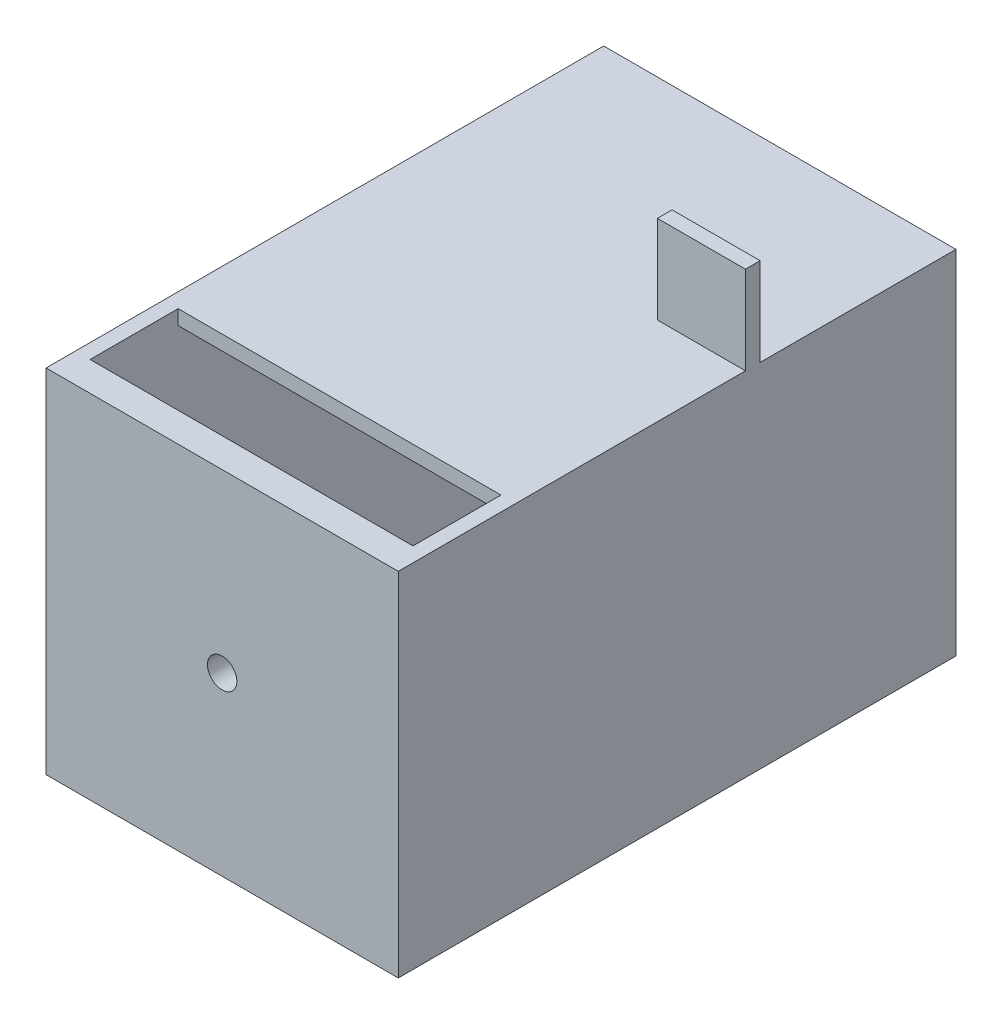
ISO-10303-21;
HEADER;
FILE_DESCRIPTION(('STEP AP214'),'2;1');
FILE_NAME('part.step','',(''),(''),'','','');
FILE_SCHEMA(('AUTOMOTIVE_DESIGN { 1 0 10303 214 1 1 1 1 }'));
ENDSEC;
DATA;
#1=APPLICATION_CONTEXT('core data for automotive mechanical design processes');
#2=APPLICATION_PROTOCOL_DEFINITION('international standard','automotive_design',2000,#1);
#3=PRODUCT_CONTEXT('',#1,'mechanical');
#4=PRODUCT('Part','Part','',(#3));
#5=PRODUCT_RELATED_PRODUCT_CATEGORY('part','',(#4));
#6=PRODUCT_DEFINITION_FORMATION('','',#4);
#7=PRODUCT_DEFINITION_CONTEXT('part definition',#1,'design');
#8=PRODUCT_DEFINITION('design','',#6,#7);
#9=PRODUCT_DEFINITION_SHAPE('','',#8);
#10=(LENGTH_UNIT() NAMED_UNIT(*) SI_UNIT(.MILLI.,.METRE.));
#11=(NAMED_UNIT(*) PLANE_ANGLE_UNIT() SI_UNIT($,.RADIAN.));
#12=(NAMED_UNIT(*) SI_UNIT($,.STERADIAN.) SOLID_ANGLE_UNIT());
#13=UNCERTAINTY_MEASURE_WITH_UNIT(LENGTH_MEASURE(1.E-05),#10,'distance_accuracy_value','');
#14=(GEOMETRIC_REPRESENTATION_CONTEXT(3) GLOBAL_UNCERTAINTY_ASSIGNED_CONTEXT((#13)) GLOBAL_UNIT_ASSIGNED_CONTEXT((#10,
#11,#12)) REPRESENTATION_CONTEXT('',''));
#15=CARTESIAN_POINT('',(0.,0.,0.));
#16=DIRECTION('',(0.,0.,1.));
#17=DIRECTION('',(1.,0.,0.));
#18=AXIS2_PLACEMENT_3D('',#15,#16,#17);
#19=CARTESIAN_POINT('',(-60.,60.,180.));
#20=DIRECTION('',(0.,-1.,0.));
#21=DIRECTION('',(0.,0.,-1.));
#22=AXIS2_PLACEMENT_3D('',#19,#20,#21);
#23=PLANE('',#22);
#24=DIRECTION('',(1.,0.,0.));
#25=VECTOR('',#24,1.);
#26=CARTESIAN_POINT('',(55.,60.,180.));
#27=LINE('',#26,#25);
#28=CARTESIAN_POINT('',(-55.,60.,180.));
#29=VERTEX_POINT('',#28);
#30=CARTESIAN_POINT('',(55.,60.,180.));
#31=VERTEX_POINT('',#30);
#32=EDGE_CURVE('E188',#29,#31,#27,.T.);
#33=ORIENTED_EDGE('',*,*,#32,.F.);
#34=DIRECTION('',(0.,0.,1.));
#35=VECTOR('',#34,1.);
#36=CARTESIAN_POINT('',(-55.,60.,180.));
#37=LINE('',#36,#35);
#38=CARTESIAN_POINT('',(-55.,60.,150.));
#39=VERTEX_POINT('',#38);
#40=EDGE_CURVE('E185',#39,#29,#37,.T.);
#41=ORIENTED_EDGE('',*,*,#40,.F.);
#42=DIRECTION('',(-1.,0.,0.));
#43=VECTOR('',#42,1.);
#44=CARTESIAN_POINT('',(55.,60.,150.));
#45=LINE('',#44,#43);
#46=CARTESIAN_POINT('',(55.,60.,150.));
#47=VERTEX_POINT('',#46);
#48=EDGE_CURVE('E199',#47,#39,#45,.T.);
#49=ORIENTED_EDGE('',*,*,#48,.F.);
#50=DIRECTION('',(0.,0.,-1.));
#51=VECTOR('',#50,1.);
#52=CARTESIAN_POINT('',(55.,60.,180.));
#53=LINE('',#52,#51);
#54=EDGE_CURVE('E196',#31,#47,#53,.T.);
#55=ORIENTED_EDGE('',*,*,#54,.F.);
#56=EDGE_LOOP('',(#33,#41,#49,#55));
#57=FACE_BOUND('',#56,.T.);
#58=DIRECTION('',(1.,0.,0.));
#59=VECTOR('',#58,1.);
#60=CARTESIAN_POINT('',(60.,60.,71.7017708237825));
#61=LINE('',#60,#59);
#62=CARTESIAN_POINT('',(30.,60.,71.7017708237825));
#63=VERTEX_POINT('',#62);
#64=CARTESIAN_POINT('',(60.,60.,71.7017708237825));
#65=VERTEX_POINT('',#64);
#66=EDGE_CURVE('E54',#63,#65,#61,.T.);
#67=ORIENTED_EDGE('',*,*,#66,.F.);
#68=DIRECTION('',(0.,0.,1.));
#69=VECTOR('',#68,1.);
#70=CARTESIAN_POINT('',(30.,60.,66.7017708237825));
#71=LINE('',#70,#69);
#72=CARTESIAN_POINT('',(30.,60.,66.7017708237825));
#73=VERTEX_POINT('',#72);
#74=EDGE_CURVE('E324',#73,#63,#71,.T.);
#75=ORIENTED_EDGE('',*,*,#74,.F.);
#76=DIRECTION('',(-1.,0.,0.));
#77=VECTOR('',#76,1.);
#78=CARTESIAN_POINT('',(60.,60.,66.7017708237825));
#79=LINE('',#78,#77);
#80=CARTESIAN_POINT('',(60.,60.,66.7017708237825));
#81=VERTEX_POINT('',#80);
#82=EDGE_CURVE('E60',#81,#73,#79,.T.);
#83=ORIENTED_EDGE('',*,*,#82,.F.);
#84=DIRECTION('',(0.,0.,-1.));
#85=VECTOR('',#84,1.);
#86=CARTESIAN_POINT('',(60.,60.,180.));
#87=LINE('',#86,#85);
#88=CARTESIAN_POINT('',(60.,60.,0.));
#89=VERTEX_POINT('',#88);
#90=EDGE_CURVE('E184',#81,#89,#87,.T.);
#91=ORIENTED_EDGE('',*,*,#90,.T.);
#92=DIRECTION('',(-1.,0.,0.));
#93=VECTOR('',#92,1.);
#94=CARTESIAN_POINT('',(-60.,60.,0.));
#95=LINE('',#94,#93);
#96=CARTESIAN_POINT('',(-60.,60.,0.));
#97=VERTEX_POINT('',#96);
#98=EDGE_CURVE('E253',#89,#97,#95,.T.);
#99=ORIENTED_EDGE('',*,*,#98,.T.);
#100=DIRECTION('',(0.,0.,-1.));
#101=VECTOR('',#100,1.);
#102=CARTESIAN_POINT('',(-60.,60.,180.));
#103=LINE('',#102,#101);
#104=CARTESIAN_POINT('',(-60.,60.,190.));
#105=VERTEX_POINT('',#104);
#106=EDGE_CURVE('E298',#105,#97,#103,.T.);
#107=ORIENTED_EDGE('',*,*,#106,.F.);
#108=DIRECTION('',(-1.,0.,0.));
#109=VECTOR('',#108,1.);
#110=CARTESIAN_POINT('',(-60.,60.,190.));
#111=LINE('',#110,#109);
#112=CARTESIAN_POINT('',(60.,60.,190.));
#113=VERTEX_POINT('',#112);
#114=EDGE_CURVE('E219',#113,#105,#111,.T.);
#115=ORIENTED_EDGE('',*,*,#114,.F.);
#116=EDGE_CURVE('E47',#113,#65,#87,.T.);
#117=ORIENTED_EDGE('',*,*,#116,.T.);
#118=EDGE_LOOP('',(#67,#75,#83,#91,#99,#107,#115,#117));
#119=FACE_BOUND('',#118,.T.);
#120=ADVANCED_FACE('F39',(#57,#119),#23,.F.);
#121=CARTESIAN_POINT('',(60.,60.,180.));
#122=DIRECTION('',(-1.,0.,0.));
#123=DIRECTION('',(0.,-1.,0.));
#124=AXIS2_PLACEMENT_3D('',#121,#122,#123);
#125=PLANE('',#124);
#126=DIRECTION('',(0.,1.,0.));
#127=VECTOR('',#126,1.);
#128=CARTESIAN_POINT('',(60.,60.,0.));
#129=LINE('',#128,#127);
#130=CARTESIAN_POINT('',(60.,-60.,0.));
#131=VERTEX_POINT('',#130);
#132=EDGE_CURVE('E251',#131,#89,#129,.T.);
#133=ORIENTED_EDGE('',*,*,#132,.T.);
#134=ORIENTED_EDGE('',*,*,#90,.F.);
#135=DIRECTION('',(0.,-1.,0.));
#136=VECTOR('',#135,1.);
#137=CARTESIAN_POINT('',(60.,90.,66.7017708237825));
#138=LINE('',#137,#136);
#139=CARTESIAN_POINT('',(60.,90.,66.7017708237825));
#140=VERTEX_POINT('',#139);
#141=EDGE_CURVE('E167',#140,#81,#138,.T.);
#142=ORIENTED_EDGE('',*,*,#141,.F.);
#143=DIRECTION('',(0.,0.,-1.));
#144=VECTOR('',#143,1.);
#145=CARTESIAN_POINT('',(60.,90.,66.7017708237825));
#146=LINE('',#145,#144);
#147=CARTESIAN_POINT('',(60.,90.,71.7017708237825));
#148=VERTEX_POINT('',#147);
#149=EDGE_CURVE('E173',#148,#140,#146,.T.);
#150=ORIENTED_EDGE('',*,*,#149,.F.);
#151=DIRECTION('',(0.,-1.,0.));
#152=VECTOR('',#151,1.);
#153=CARTESIAN_POINT('',(60.,90.,71.7017708237825));
#154=LINE('',#153,#152);
#155=EDGE_CURVE('E317',#148,#65,#154,.T.);
#156=ORIENTED_EDGE('',*,*,#155,.T.);
#157=ORIENTED_EDGE('',*,*,#116,.F.);
#158=DIRECTION('',(0.,1.,0.));
#159=VECTOR('',#158,1.);
#160=CARTESIAN_POINT('',(60.,60.,190.));
#161=LINE('',#160,#159);
#162=CARTESIAN_POINT('',(60.,-60.,190.));
#163=VERTEX_POINT('',#162);
#164=EDGE_CURVE('E216',#163,#113,#161,.T.);
#165=ORIENTED_EDGE('',*,*,#164,.F.);
#166=DIRECTION('',(0.,0.,-1.));
#167=VECTOR('',#166,1.);
#168=CARTESIAN_POINT('',(60.,-60.,180.));
#169=LINE('',#168,#167);
#170=EDGE_CURVE('E11',#163,#131,#169,.T.);
#171=ORIENTED_EDGE('',*,*,#170,.T.);
#172=EDGE_LOOP('',(#133,#134,#142,#150,#156,#157,#165,#171));
#173=FACE_BOUND('',#172,.T.);
#174=ADVANCED_FACE('F41',(#173),#125,.F.);
#175=CARTESIAN_POINT('',(-60.,60.,180.));
#176=DIRECTION('',(1.,0.,0.));
#177=DIRECTION('',(0.,1.,0.));
#178=AXIS2_PLACEMENT_3D('',#175,#176,#177);
#179=PLANE('',#178);
#180=DIRECTION('',(0.,-1.,0.));
#181=VECTOR('',#180,1.);
#182=CARTESIAN_POINT('',(-60.,60.,0.));
#183=LINE('',#182,#181);
#184=CARTESIAN_POINT('',(-60.,-60.,0.));
#185=VERTEX_POINT('',#184);
#186=EDGE_CURVE('E255',#97,#185,#183,.T.);
#187=ORIENTED_EDGE('',*,*,#186,.T.);
#188=DIRECTION('',(0.,0.,-1.));
#189=VECTOR('',#188,1.);
#190=CARTESIAN_POINT('',(-60.,-60.,180.));
#191=LINE('',#190,#189);
#192=CARTESIAN_POINT('',(-60.,-60.,190.));
#193=VERTEX_POINT('',#192);
#194=EDGE_CURVE('E295',#193,#185,#191,.T.);
#195=ORIENTED_EDGE('',*,*,#194,.F.);
#196=DIRECTION('',(0.,-1.,0.));
#197=VECTOR('',#196,1.);
#198=CARTESIAN_POINT('',(-60.,60.,190.));
#199=LINE('',#198,#197);
#200=EDGE_CURVE('E222',#105,#193,#199,.T.);
#201=ORIENTED_EDGE('',*,*,#200,.F.);
#202=ORIENTED_EDGE('',*,*,#106,.T.);
#203=EDGE_LOOP('',(#187,#195,#201,#202));
#204=FACE_BOUND('',#203,.T.);
#205=ADVANCED_FACE('F310',(#204),#179,.F.);
#206=CARTESIAN_POINT('',(-60.,-60.,180.));
#207=DIRECTION('',(0.,1.,0.));
#208=DIRECTION('',(-1.,0.,0.));
#209=AXIS2_PLACEMENT_3D('',#206,#207,#208);
#210=PLANE('',#209);
#211=DIRECTION('',(1.,0.,0.));
#212=VECTOR('',#211,1.);
#213=CARTESIAN_POINT('',(-60.,-60.,0.));
#214=LINE('',#213,#212);
#215=CARTESIAN_POINT('',(-40.,-60.,0.));
#216=VERTEX_POINT('',#215);
#217=EDGE_CURVE('E257',#185,#216,#214,.T.);
#218=ORIENTED_EDGE('',*,*,#217,.T.);
#219=DIRECTION('',(0.,0.,-1.));
#220=VECTOR('',#219,1.);
#221=CARTESIAN_POINT('',(-40.,-60.,180.));
#222=LINE('',#221,#220);
#223=CARTESIAN_POINT('',(-40.,-60.,180.));
#224=VERTEX_POINT('',#223);
#225=EDGE_CURVE('E292',#224,#216,#222,.T.);
#226=ORIENTED_EDGE('',*,*,#225,.F.);
#227=DIRECTION('',(1.,0.,0.));
#228=VECTOR('',#227,1.);
#229=CARTESIAN_POINT('',(-60.,-60.,180.));
#230=LINE('',#229,#228);
#231=CARTESIAN_POINT('',(40.,-60.,180.));
#232=VERTEX_POINT('',#231);
#233=EDGE_CURVE('E213',#224,#232,#230,.T.);
#234=ORIENTED_EDGE('',*,*,#233,.T.);
#235=DIRECTION('',(0.,0.,-1.));
#236=VECTOR('',#235,1.);
#237=CARTESIAN_POINT('',(40.,-60.,180.));
#238=LINE('',#237,#236);
#239=CARTESIAN_POINT('',(40.,-60.,0.));
#240=VERTEX_POINT('',#239);
#241=EDGE_CURVE('E248',#232,#240,#238,.T.);
#242=ORIENTED_EDGE('',*,*,#241,.T.);
#243=DIRECTION('',(1.,0.,0.));
#244=VECTOR('',#243,1.);
#245=CARTESIAN_POINT('',(40.,-60.,0.));
#246=LINE('',#245,#244);
#247=EDGE_CURVE('E228',#240,#131,#246,.T.);
#248=ORIENTED_EDGE('',*,*,#247,.T.);
#249=ORIENTED_EDGE('',*,*,#170,.F.);
#250=DIRECTION('',(1.,0.,0.));
#251=VECTOR('',#250,1.);
#252=CARTESIAN_POINT('',(-60.,-60.,190.));
#253=LINE('',#252,#251);
#254=EDGE_CURVE('E225',#193,#163,#253,.T.);
#255=ORIENTED_EDGE('',*,*,#254,.F.);
#256=ORIENTED_EDGE('',*,*,#194,.T.);
#257=EDGE_LOOP('',(#218,#226,#234,#242,#248,#249,#255,#256));
#258=FACE_BOUND('',#257,.T.);
#259=ADVANCED_FACE('F314',(#258),#210,.F.);
#260=CARTESIAN_POINT('',(-40.,-60.,180.));
#261=DIRECTION('',(-1.,0.,0.));
#262=DIRECTION('',(0.,0.,1.));
#263=AXIS2_PLACEMENT_3D('',#260,#261,#262);
#264=PLANE('',#263);
#265=DIRECTION('',(0.,1.,0.));
#266=VECTOR('',#265,1.);
#267=CARTESIAN_POINT('',(-40.,-60.,0.));
#268=LINE('',#267,#266);
#269=CARTESIAN_POINT('',(-40.,-55.,0.));
#270=VERTEX_POINT('',#269);
#271=EDGE_CURVE('E259',#216,#270,#268,.T.);
#272=ORIENTED_EDGE('',*,*,#271,.T.);
#273=DIRECTION('',(0.,0.,-1.));
#274=VECTOR('',#273,1.);
#275=CARTESIAN_POINT('',(-40.,-55.,180.));
#276=LINE('',#275,#274);
#277=CARTESIAN_POINT('',(-40.,-55.,180.));
#278=VERTEX_POINT('',#277);
#279=EDGE_CURVE('E289',#278,#270,#276,.T.);
#280=ORIENTED_EDGE('',*,*,#279,.F.);
#281=DIRECTION('',(0.,1.,0.));
#282=VECTOR('',#281,1.);
#283=CARTESIAN_POINT('',(-40.,-60.,180.));
#284=LINE('',#283,#282);
#285=EDGE_CURVE('E231',#224,#278,#284,.T.);
#286=ORIENTED_EDGE('',*,*,#285,.F.);
#287=ORIENTED_EDGE('',*,*,#225,.T.);
#288=EDGE_LOOP('',(#272,#280,#286,#287));
#289=FACE_BOUND('',#288,.T.);
#290=ADVANCED_FACE('F351',(#289),#264,.F.);
#291=CARTESIAN_POINT('',(-40.,-55.,180.));
#292=DIRECTION('',(0.,-1.,0.));
#293=DIRECTION('',(1.,0.,0.));
#294=AXIS2_PLACEMENT_3D('',#291,#292,#293);
#295=PLANE('',#294);
#296=DIRECTION('',(-1.,0.,0.));
#297=VECTOR('',#296,1.);
#298=CARTESIAN_POINT('',(-40.,-55.,0.));
#299=LINE('',#298,#297);
#300=CARTESIAN_POINT('',(-55.,-55.,0.));
#301=VERTEX_POINT('',#300);
#302=EDGE_CURVE('E261',#270,#301,#299,.T.);
#303=ORIENTED_EDGE('',*,*,#302,.T.);
#304=DIRECTION('',(0.,0.,-1.));
#305=VECTOR('',#304,1.);
#306=CARTESIAN_POINT('',(-55.,-55.,180.));
#307=LINE('',#306,#305);
#308=CARTESIAN_POINT('',(-55.,-55.,180.));
#309=VERTEX_POINT('',#308);
#310=EDGE_CURVE('E286',#309,#301,#307,.T.);
#311=ORIENTED_EDGE('',*,*,#310,.F.);
#312=DIRECTION('',(-1.,0.,0.));
#313=VECTOR('',#312,1.);
#314=CARTESIAN_POINT('',(-40.,-55.,180.));
#315=LINE('',#314,#313);
#316=EDGE_CURVE('E234',#278,#309,#315,.T.);
#317=ORIENTED_EDGE('',*,*,#316,.F.);
#318=ORIENTED_EDGE('',*,*,#279,.T.);
#319=EDGE_LOOP('',(#303,#311,#317,#318));
#320=FACE_BOUND('',#319,.T.);
#321=ADVANCED_FACE('F354',(#320),#295,.F.);
#322=CARTESIAN_POINT('',(-55.,-55.,180.));
#323=DIRECTION('',(-1.,0.,0.));
#324=DIRECTION('',(0.,0.,1.));
#325=AXIS2_PLACEMENT_3D('',#322,#323,#324);
#326=PLANE('',#325);
#327=DIRECTION('',(0.,0.,-1.));
#328=VECTOR('',#327,1.);
#329=CARTESIAN_POINT('',(-55.,55.,180.));
#330=LINE('',#329,#328);
#331=CARTESIAN_POINT('',(-55.,55.,150.));
#332=VERTEX_POINT('',#331);
#333=CARTESIAN_POINT('',(-55.,55.,0.));
#334=VERTEX_POINT('',#333);
#335=EDGE_CURVE('E284',#332,#334,#330,.T.);
#336=ORIENTED_EDGE('',*,*,#335,.F.);
#337=DIRECTION('',(0.,1.,0.));
#338=VECTOR('',#337,1.);
#339=CARTESIAN_POINT('',(-55.,50.,150.));
#340=LINE('',#339,#338);
#341=EDGE_CURVE('E203',#332,#39,#340,.T.);
#342=ORIENTED_EDGE('',*,*,#341,.T.);
#343=ORIENTED_EDGE('',*,*,#40,.T.);
#344=DIRECTION('',(0.,1.,0.));
#345=VECTOR('',#344,1.);
#346=CARTESIAN_POINT('',(-55.,-55.,180.));
#347=LINE('',#346,#345);
#348=EDGE_CURVE('E238',#309,#29,#347,.T.);
#349=ORIENTED_EDGE('',*,*,#348,.F.);
#350=ORIENTED_EDGE('',*,*,#310,.T.);
#351=DIRECTION('',(0.,1.,0.));
#352=VECTOR('',#351,1.);
#353=CARTESIAN_POINT('',(-55.,-55.,0.));
#354=LINE('',#353,#352);
#355=EDGE_CURVE('E263',#301,#334,#354,.T.);
#356=ORIENTED_EDGE('',*,*,#355,.T.);
#357=EDGE_LOOP('',(#336,#342,#343,#349,#350,#356));
#358=FACE_BOUND('',#357,.T.);
#359=ADVANCED_FACE('F358',(#358),#326,.F.);
#360=CARTESIAN_POINT('',(55.,55.,180.));
#361=DIRECTION('',(0.,1.,0.));
#362=DIRECTION('',(0.,0.,1.));
#363=AXIS2_PLACEMENT_3D('',#360,#361,#362);
#364=PLANE('',#363);
#365=DIRECTION('',(0.,0.,-1.));
#366=VECTOR('',#365,1.);
#367=CARTESIAN_POINT('',(55.,55.,180.));
#368=LINE('',#367,#366);
#369=CARTESIAN_POINT('',(55.,55.,150.));
#370=VERTEX_POINT('',#369);
#371=CARTESIAN_POINT('',(55.,55.,0.));
#372=VERTEX_POINT('',#371);
#373=EDGE_CURVE('E282',#370,#372,#368,.T.);
#374=ORIENTED_EDGE('',*,*,#373,.F.);
#375=DIRECTION('',(-1.,0.,0.));
#376=VECTOR('',#375,1.);
#377=CARTESIAN_POINT('',(55.,55.,150.));
#378=LINE('',#377,#376);
#379=EDGE_CURVE('E205',#370,#332,#378,.T.);
#380=ORIENTED_EDGE('',*,*,#379,.T.);
#381=ORIENTED_EDGE('',*,*,#335,.T.);
#382=DIRECTION('',(1.,0.,0.));
#383=VECTOR('',#382,1.);
#384=CARTESIAN_POINT('',(55.,55.,0.));
#385=LINE('',#384,#383);
#386=EDGE_CURVE('E266',#334,#372,#385,.T.);
#387=ORIENTED_EDGE('',*,*,#386,.T.);
#388=EDGE_LOOP('',(#374,#380,#381,#387));
#389=FACE_BOUND('',#388,.T.);
#390=ADVANCED_FACE('F362',(#389),#364,.F.);
#391=CARTESIAN_POINT('',(55.,-55.,180.));
#392=DIRECTION('',(1.,0.,0.));
#393=DIRECTION('',(0.,0.,-1.));
#394=AXIS2_PLACEMENT_3D('',#391,#392,#393);
#395=PLANE('',#394);
#396=DIRECTION('',(0.,-1.,0.));
#397=VECTOR('',#396,1.);
#398=CARTESIAN_POINT('',(55.,-55.,180.));
#399=LINE('',#398,#397);
#400=CARTESIAN_POINT('',(55.,-55.,180.));
#401=VERTEX_POINT('',#400);
#402=EDGE_CURVE('E240',#31,#401,#399,.T.);
#403=ORIENTED_EDGE('',*,*,#402,.F.);
#404=ORIENTED_EDGE('',*,*,#54,.T.);
#405=DIRECTION('',(0.,1.,0.));
#406=VECTOR('',#405,1.);
#407=CARTESIAN_POINT('',(55.,50.,150.));
#408=LINE('',#407,#406);
#409=EDGE_CURVE('E202',#370,#47,#408,.T.);
#410=ORIENTED_EDGE('',*,*,#409,.F.);
#411=ORIENTED_EDGE('',*,*,#373,.T.);
#412=DIRECTION('',(0.,-1.,0.));
#413=VECTOR('',#412,1.);
#414=CARTESIAN_POINT('',(55.,-55.,0.));
#415=LINE('',#414,#413);
#416=CARTESIAN_POINT('',(55.,-55.,0.));
#417=VERTEX_POINT('',#416);
#418=EDGE_CURVE('E269',#372,#417,#415,.T.);
#419=ORIENTED_EDGE('',*,*,#418,.T.);
#420=DIRECTION('',(0.,0.,-1.));
#421=VECTOR('',#420,1.);
#422=CARTESIAN_POINT('',(55.,-55.,180.));
#423=LINE('',#422,#421);
#424=EDGE_CURVE('E279',#401,#417,#423,.T.);
#425=ORIENTED_EDGE('',*,*,#424,.F.);
#426=EDGE_LOOP('',(#403,#404,#410,#411,#419,#425));
#427=FACE_BOUND('',#426,.T.);
#428=ADVANCED_FACE('F366',(#427),#395,.F.);
#429=CARTESIAN_POINT('',(55.,-55.,180.));
#430=DIRECTION('',(0.,-1.,0.));
#431=DIRECTION('',(1.,0.,0.));
#432=AXIS2_PLACEMENT_3D('',#429,#430,#431);
#433=PLANE('',#432);
#434=DIRECTION('',(-1.,0.,0.));
#435=VECTOR('',#434,1.);
#436=CARTESIAN_POINT('',(55.,-55.,0.));
#437=LINE('',#436,#435);
#438=CARTESIAN_POINT('',(40.,-55.,0.));
#439=VERTEX_POINT('',#438);
#440=EDGE_CURVE('E271',#417,#439,#437,.T.);
#441=ORIENTED_EDGE('',*,*,#440,.T.);
#442=DIRECTION('',(0.,0.,-1.));
#443=VECTOR('',#442,1.);
#444=CARTESIAN_POINT('',(40.,-55.,180.));
#445=LINE('',#444,#443);
#446=CARTESIAN_POINT('',(40.,-55.,180.));
#447=VERTEX_POINT('',#446);
#448=EDGE_CURVE('E276',#447,#439,#445,.T.);
#449=ORIENTED_EDGE('',*,*,#448,.F.);
#450=DIRECTION('',(-1.,0.,0.));
#451=VECTOR('',#450,1.);
#452=CARTESIAN_POINT('',(55.,-55.,180.));
#453=LINE('',#452,#451);
#454=EDGE_CURVE('E242',#401,#447,#453,.T.);
#455=ORIENTED_EDGE('',*,*,#454,.F.);
#456=ORIENTED_EDGE('',*,*,#424,.T.);
#457=EDGE_LOOP('',(#441,#449,#455,#456));
#458=FACE_BOUND('',#457,.T.);
#459=ADVANCED_FACE('F370',(#458),#433,.F.);
#460=CARTESIAN_POINT('',(40.,-60.,180.));
#461=DIRECTION('',(1.,0.,0.));
#462=DIRECTION('',(0.,0.,-1.));
#463=AXIS2_PLACEMENT_3D('',#460,#461,#462);
#464=PLANE('',#463);
#465=DIRECTION('',(0.,-1.,0.));
#466=VECTOR('',#465,1.);
#467=CARTESIAN_POINT('',(40.,-60.,0.));
#468=LINE('',#467,#466);
#469=EDGE_CURVE('E235',#439,#240,#468,.T.);
#470=ORIENTED_EDGE('',*,*,#469,.T.);
#471=ORIENTED_EDGE('',*,*,#241,.F.);
#472=DIRECTION('',(0.,-1.,0.));
#473=VECTOR('',#472,1.);
#474=CARTESIAN_POINT('',(40.,-60.,180.));
#475=LINE('',#474,#473);
#476=EDGE_CURVE('E245',#447,#232,#475,.T.);
#477=ORIENTED_EDGE('',*,*,#476,.F.);
#478=ORIENTED_EDGE('',*,*,#448,.T.);
#479=EDGE_LOOP('',(#470,#471,#477,#478));
#480=FACE_BOUND('',#479,.T.);
#481=ADVANCED_FACE('F374',(#480),#464,.F.);
#482=CARTESIAN_POINT('',(0.,0.,0.));
#483=DIRECTION('',(0.,0.,-1.));
#484=DIRECTION('',(-1.,0.,0.));
#485=AXIS2_PLACEMENT_3D('',#482,#483,#484);
#486=PLANE('',#485);
#487=ORIENTED_EDGE('',*,*,#247,.F.);
#488=ORIENTED_EDGE('',*,*,#469,.F.);
#489=ORIENTED_EDGE('',*,*,#440,.F.);
#490=ORIENTED_EDGE('',*,*,#418,.F.);
#491=ORIENTED_EDGE('',*,*,#386,.F.);
#492=ORIENTED_EDGE('',*,*,#355,.F.);
#493=ORIENTED_EDGE('',*,*,#302,.F.);
#494=ORIENTED_EDGE('',*,*,#271,.F.);
#495=ORIENTED_EDGE('',*,*,#217,.F.);
#496=ORIENTED_EDGE('',*,*,#186,.F.);
#497=ORIENTED_EDGE('',*,*,#98,.F.);
#498=ORIENTED_EDGE('',*,*,#132,.F.);
#499=EDGE_LOOP('',(#487,#488,#489,#490,#491,#492,#493,#494,#495,#496,#497,#498));
#500=FACE_BOUND('',#499,.T.);
#501=ADVANCED_FACE('F306',(#500),#486,.T.);
#502=CARTESIAN_POINT('',(0.,0.,180.));
#503=DIRECTION('',(0.,0.,1.));
#504=DIRECTION('',(1.,0.,0.));
#505=AXIS2_PLACEMENT_3D('',#502,#503,#504);
#506=PLANE('',#505);
#507=ORIENTED_EDGE('',*,*,#402,.T.);
#508=ORIENTED_EDGE('',*,*,#454,.T.);
#509=ORIENTED_EDGE('',*,*,#476,.T.);
#510=ORIENTED_EDGE('',*,*,#233,.F.);
#511=ORIENTED_EDGE('',*,*,#285,.T.);
#512=ORIENTED_EDGE('',*,*,#316,.T.);
#513=ORIENTED_EDGE('',*,*,#348,.T.);
#514=ORIENTED_EDGE('',*,*,#32,.T.);
#515=EDGE_LOOP('',(#507,#508,#509,#510,#511,#512,#513,#514));
#516=FACE_BOUND('',#515,.T.);
#517=CARTESIAN_POINT('',(0.,0.,180.));
#518=DIRECTION('',(0.,0.,1.));
#519=DIRECTION('',(1.,0.,0.));
#520=AXIS2_PLACEMENT_3D('',#517,#518,#519);
#521=CIRCLE('',#520,5.);
#522=CARTESIAN_POINT('',(5.,0.,180.));
#523=VERTEX_POINT('',#522);
#524=EDGE_CURVE('E210',#523,#523,#521,.T.);
#525=ORIENTED_EDGE('',*,*,#524,.T.);
#526=EDGE_LOOP('',(#525));
#527=FACE_BOUND('',#526,.T.);
#528=ADVANCED_FACE('F381',(#516,#527),#506,.F.);
#529=CARTESIAN_POINT('',(0.,0.,190.));
#530=DIRECTION('',(0.,0.,1.));
#531=DIRECTION('',(1.,0.,0.));
#532=AXIS2_PLACEMENT_3D('',#529,#530,#531);
#533=PLANE('',#532);
#534=CARTESIAN_POINT('',(0.,0.,190.));
#535=DIRECTION('',(0.,0.,1.));
#536=DIRECTION('',(1.,0.,0.));
#537=AXIS2_PLACEMENT_3D('',#534,#535,#536);
#538=CIRCLE('',#537,5.);
#539=CARTESIAN_POINT('',(5.,0.,190.));
#540=VERTEX_POINT('',#539);
#541=EDGE_CURVE('E209',#540,#540,#538,.T.);
#542=ORIENTED_EDGE('',*,*,#541,.F.);
#543=EDGE_LOOP('',(#542));
#544=FACE_BOUND('',#543,.T.);
#545=ORIENTED_EDGE('',*,*,#164,.T.);
#546=ORIENTED_EDGE('',*,*,#114,.T.);
#547=ORIENTED_EDGE('',*,*,#200,.T.);
#548=ORIENTED_EDGE('',*,*,#254,.T.);
#549=EDGE_LOOP('',(#545,#546,#547,#548));
#550=FACE_BOUND('',#549,.T.);
#551=ADVANCED_FACE('F316',(#544,#550),#533,.T.);
#552=CARTESIAN_POINT('',(0.,0.,180.));
#553=DIRECTION('',(0.,0.,1.));
#554=DIRECTION('',(1.,0.,0.));
#555=AXIS2_PLACEMENT_3D('',#552,#553,#554);
#556=CYLINDRICAL_SURFACE('',#555,5.);
#557=ORIENTED_EDGE('',*,*,#524,.F.);
#558=EDGE_LOOP('',(#557));
#559=FACE_BOUND('',#558,.T.);
#560=ORIENTED_EDGE('',*,*,#541,.T.);
#561=EDGE_LOOP('',(#560));
#562=FACE_BOUND('',#561,.T.);
#563=ADVANCED_FACE('F387',(#559,#562),#556,.F.);
#564=CARTESIAN_POINT('',(55.,50.,150.));
#565=DIRECTION('',(0.,0.,-1.));
#566=DIRECTION('',(-1.,0.,0.));
#567=AXIS2_PLACEMENT_3D('',#564,#565,#566);
#568=PLANE('',#567);
#569=ORIENTED_EDGE('',*,*,#409,.T.);
#570=ORIENTED_EDGE('',*,*,#48,.T.);
#571=ORIENTED_EDGE('',*,*,#341,.F.);
#572=ORIENTED_EDGE('',*,*,#379,.F.);
#573=EDGE_LOOP('',(#569,#570,#571,#572));
#574=FACE_BOUND('',#573,.T.);
#575=ADVANCED_FACE('F391',(#574),#568,.F.);
#576=CARTESIAN_POINT('',(60.,90.,66.7017708237825));
#577=DIRECTION('',(0.,0.,1.));
#578=DIRECTION('',(1.,0.,0.));
#579=AXIS2_PLACEMENT_3D('',#576,#577,#578);
#580=PLANE('',#579);
#581=ORIENTED_EDGE('',*,*,#82,.T.);
#582=DIRECTION('',(0.,-1.,0.));
#583=VECTOR('',#582,1.);
#584=CARTESIAN_POINT('',(30.,90.,66.7017708237825));
#585=LINE('',#584,#583);
#586=CARTESIAN_POINT('',(30.,90.,66.7017708237825));
#587=VERTEX_POINT('',#586);
#588=EDGE_CURVE('E169',#587,#73,#585,.T.);
#589=ORIENTED_EDGE('',*,*,#588,.F.);
#590=DIRECTION('',(-1.,0.,0.));
#591=VECTOR('',#590,1.);
#592=CARTESIAN_POINT('',(60.,90.,66.7017708237825));
#593=LINE('',#592,#591);
#594=EDGE_CURVE('E163',#140,#587,#593,.T.);
#595=ORIENTED_EDGE('',*,*,#594,.F.);
#596=ORIENTED_EDGE('',*,*,#141,.T.);
#597=EDGE_LOOP('',(#581,#589,#595,#596));
#598=FACE_BOUND('',#597,.T.);
#599=ADVANCED_FACE('F165',(#598),#580,.F.);
#600=CARTESIAN_POINT('',(30.,90.,66.7017708237825));
#601=DIRECTION('',(1.,0.,0.));
#602=DIRECTION('',(0.,0.,-1.));
#603=AXIS2_PLACEMENT_3D('',#600,#601,#602);
#604=PLANE('',#603);
#605=ORIENTED_EDGE('',*,*,#74,.T.);
#606=DIRECTION('',(0.,-1.,0.));
#607=VECTOR('',#606,1.);
#608=CARTESIAN_POINT('',(30.,90.,71.7017708237825));
#609=LINE('',#608,#607);
#610=CARTESIAN_POINT('',(30.,90.,71.7017708237825));
#611=VERTEX_POINT('',#610);
#612=EDGE_CURVE('E190',#611,#63,#609,.T.);
#613=ORIENTED_EDGE('',*,*,#612,.F.);
#614=DIRECTION('',(0.,0.,1.));
#615=VECTOR('',#614,1.);
#616=CARTESIAN_POINT('',(30.,90.,66.7017708237825));
#617=LINE('',#616,#615);
#618=EDGE_CURVE('E172',#587,#611,#617,.T.);
#619=ORIENTED_EDGE('',*,*,#618,.F.);
#620=ORIENTED_EDGE('',*,*,#588,.T.);
#621=EDGE_LOOP('',(#605,#613,#619,#620));
#622=FACE_BOUND('',#621,.T.);
#623=ADVANCED_FACE('F329',(#622),#604,.F.);
#624=CARTESIAN_POINT('',(60.,90.,71.7017708237825));
#625=DIRECTION('',(0.,0.,-1.));
#626=DIRECTION('',(-1.,0.,0.));
#627=AXIS2_PLACEMENT_3D('',#624,#625,#626);
#628=PLANE('',#627);
#629=ORIENTED_EDGE('',*,*,#66,.T.);
#630=ORIENTED_EDGE('',*,*,#155,.F.);
#631=DIRECTION('',(1.,0.,0.));
#632=VECTOR('',#631,1.);
#633=CARTESIAN_POINT('',(60.,90.,71.7017708237825));
#634=LINE('',#633,#632);
#635=EDGE_CURVE('E178',#611,#148,#634,.T.);
#636=ORIENTED_EDGE('',*,*,#635,.F.);
#637=ORIENTED_EDGE('',*,*,#612,.T.);
#638=EDGE_LOOP('',(#629,#630,#636,#637));
#639=FACE_BOUND('',#638,.T.);
#640=ADVANCED_FACE('F330',(#639),#628,.F.);
#641=CARTESIAN_POINT('',(0.,90.,0.));
#642=DIRECTION('',(0.,-1.,0.));
#643=DIRECTION('',(0.,0.,-1.));
#644=AXIS2_PLACEMENT_3D('',#641,#642,#643);
#645=PLANE('',#644);
#646=ORIENTED_EDGE('',*,*,#149,.T.);
#647=ORIENTED_EDGE('',*,*,#594,.T.);
#648=ORIENTED_EDGE('',*,*,#618,.T.);
#649=ORIENTED_EDGE('',*,*,#635,.T.);
#650=EDGE_LOOP('',(#646,#647,#648,#649));
#651=FACE_BOUND('',#650,.T.);
#652=ADVANCED_FACE('F176',(#651),#645,.F.);
#653=CLOSED_SHELL('',(#120,#174,#205,#259,#290,#321,#359,#390,#428,#459,#481,#501,#528,#551,
#563,#575,#599,#623,#640,#652));
#654=MANIFOLD_SOLID_BREP('B2',#653);
#655=ADVANCED_BREP_SHAPE_REPRESENTATION('',(#18,#654),#14);
#656=SHAPE_DEFINITION_REPRESENTATION(#9,#655);
ENDSEC;
END-ISO-10303-21;
